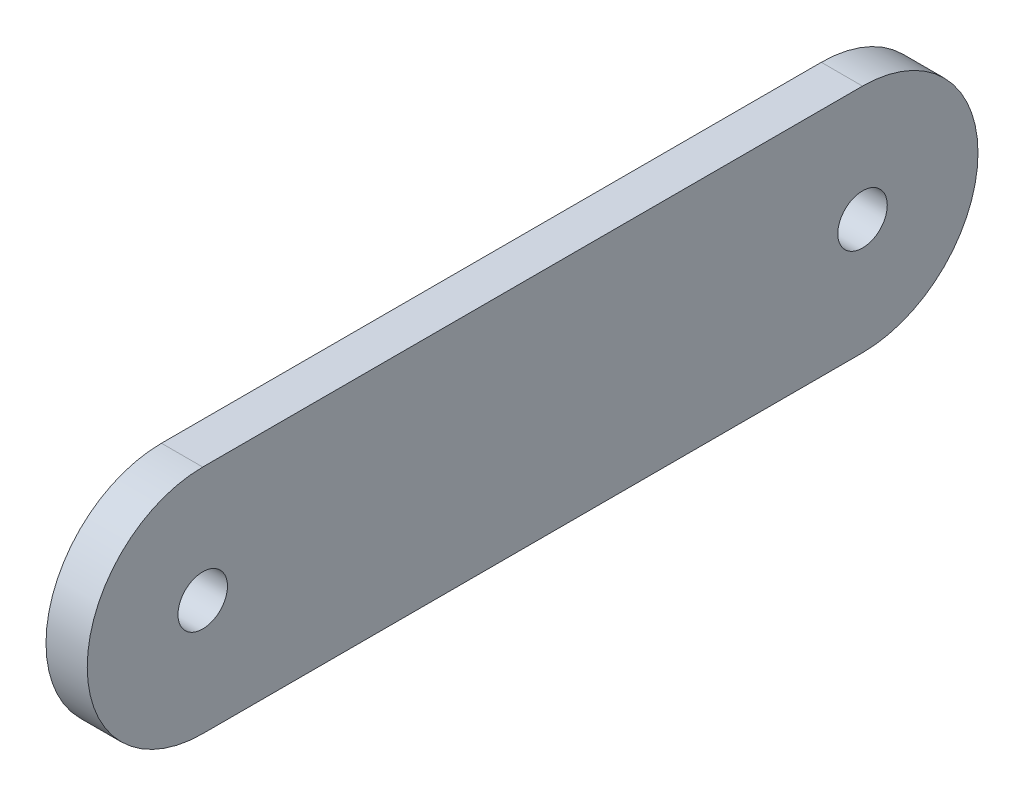
ISO-10303-21;
HEADER;
FILE_DESCRIPTION(('STEP AP214'),'2;1');
FILE_NAME('part.step','',(''),(''),'','','');
FILE_SCHEMA(('AUTOMOTIVE_DESIGN { 1 0 10303 214 1 1 1 1 }'));
ENDSEC;
DATA;
#1=APPLICATION_CONTEXT('core data for automotive mechanical design processes');
#2=APPLICATION_PROTOCOL_DEFINITION('international standard','automotive_design',2000,#1);
#3=PRODUCT_CONTEXT('',#1,'mechanical');
#4=PRODUCT('Part','Part','',(#3));
#5=PRODUCT_RELATED_PRODUCT_CATEGORY('part','',(#4));
#6=PRODUCT_DEFINITION_FORMATION('','',#4);
#7=PRODUCT_DEFINITION_CONTEXT('part definition',#1,'design');
#8=PRODUCT_DEFINITION('design','',#6,#7);
#9=PRODUCT_DEFINITION_SHAPE('','',#8);
#10=(LENGTH_UNIT() NAMED_UNIT(*) SI_UNIT(.MILLI.,.METRE.));
#11=(NAMED_UNIT(*) PLANE_ANGLE_UNIT() SI_UNIT($,.RADIAN.));
#12=(NAMED_UNIT(*) SI_UNIT($,.STERADIAN.) SOLID_ANGLE_UNIT());
#13=UNCERTAINTY_MEASURE_WITH_UNIT(LENGTH_MEASURE(1.E-05),#10,'distance_accuracy_value','');
#14=(GEOMETRIC_REPRESENTATION_CONTEXT(3) GLOBAL_UNCERTAINTY_ASSIGNED_CONTEXT((#13)) GLOBAL_UNIT_ASSIGNED_CONTEXT((#10,
#11,#12)) REPRESENTATION_CONTEXT('',''));
#15=CARTESIAN_POINT('',(0.,0.,0.));
#16=DIRECTION('',(0.,0.,1.));
#17=DIRECTION('',(1.,0.,0.));
#18=AXIS2_PLACEMENT_3D('',#15,#16,#17);
#19=CARTESIAN_POINT('',(2.5,0.,0.));
#20=DIRECTION('',(1.,0.,0.));
#21=DIRECTION('',(0.,0.,-1.));
#22=AXIS2_PLACEMENT_3D('',#19,#20,#21);
#23=PLANE('',#22);
#24=CARTESIAN_POINT('',(2.5,0.,40.));
#25=DIRECTION('',(1.,0.,0.));
#26=DIRECTION('',(0.,0.,-1.));
#27=AXIS2_PLACEMENT_3D('',#24,#25,#26);
#28=CIRCLE('',#27,1.5);
#29=CARTESIAN_POINT('',(2.5,0.,38.5));
#30=VERTEX_POINT('',#29);
#31=EDGE_CURVE('E101',#30,#30,#28,.T.);
#32=ORIENTED_EDGE('',*,*,#31,.F.);
#33=EDGE_LOOP('',(#32));
#34=FACE_BOUND('',#33,.T.);
#35=CARTESIAN_POINT('',(2.5,0.,0.));
#36=DIRECTION('',(1.,0.,0.));
#37=DIRECTION('',(0.,0.,-1.));
#38=AXIS2_PLACEMENT_3D('',#35,#36,#37);
#39=CIRCLE('',#38,7.);
#40=CARTESIAN_POINT('',(2.5,-7.,0.));
#41=VERTEX_POINT('',#40);
#42=CARTESIAN_POINT('',(2.5,7.,0.));
#43=VERTEX_POINT('',#42);
#44=EDGE_CURVE('E86',#41,#43,#39,.T.);
#45=ORIENTED_EDGE('',*,*,#44,.T.);
#46=DIRECTION('',(0.,0.,1.));
#47=VECTOR('',#46,1.);
#48=CARTESIAN_POINT('',(2.5,7.,0.));
#49=LINE('',#48,#47);
#50=CARTESIAN_POINT('',(2.5,7.,40.));
#51=VERTEX_POINT('',#50);
#52=EDGE_CURVE('E81',#43,#51,#49,.T.);
#53=ORIENTED_EDGE('',*,*,#52,.T.);
#54=CARTESIAN_POINT('',(2.5,0.,40.));
#55=DIRECTION('',(1.,0.,0.));
#56=DIRECTION('',(0.,0.,-1.));
#57=AXIS2_PLACEMENT_3D('',#54,#55,#56);
#58=CIRCLE('',#57,7.);
#59=CARTESIAN_POINT('',(2.5,-7.,40.));
#60=VERTEX_POINT('',#59);
#61=EDGE_CURVE('E84',#51,#60,#58,.T.);
#62=ORIENTED_EDGE('',*,*,#61,.T.);
#63=DIRECTION('',(0.,0.,-1.));
#64=VECTOR('',#63,1.);
#65=CARTESIAN_POINT('',(2.5,-7.,0.));
#66=LINE('',#65,#64);
#67=EDGE_CURVE('E51',#60,#41,#66,.T.);
#68=ORIENTED_EDGE('',*,*,#67,.T.);
#69=EDGE_LOOP('',(#45,#53,#62,#68));
#70=FACE_BOUND('',#69,.T.);
#71=CARTESIAN_POINT('',(2.5,0.,0.));
#72=DIRECTION('',(1.,0.,0.));
#73=DIRECTION('',(0.,0.,-1.));
#74=AXIS2_PLACEMENT_3D('',#71,#72,#73);
#75=CIRCLE('',#74,1.5);
#76=CARTESIAN_POINT('',(2.5,0.,-1.5));
#77=VERTEX_POINT('',#76);
#78=EDGE_CURVE('E116',#77,#77,#75,.T.);
#79=ORIENTED_EDGE('',*,*,#78,.F.);
#80=EDGE_LOOP('',(#79));
#81=FACE_BOUND('',#80,.T.);
#82=ADVANCED_FACE('F34',(#34,#70,#81),#23,.T.);
#83=CARTESIAN_POINT('',(0.,0.,0.));
#84=DIRECTION('',(1.,0.,0.));
#85=DIRECTION('',(0.,0.,-1.));
#86=AXIS2_PLACEMENT_3D('',#83,#84,#85);
#87=PLANE('',#86);
#88=CARTESIAN_POINT('',(0.,0.,0.));
#89=DIRECTION('',(1.,0.,0.));
#90=DIRECTION('',(0.,0.,-1.));
#91=AXIS2_PLACEMENT_3D('',#88,#89,#90);
#92=CIRCLE('',#91,7.);
#93=CARTESIAN_POINT('',(0.,-7.,0.));
#94=VERTEX_POINT('',#93);
#95=CARTESIAN_POINT('',(0.,7.,0.));
#96=VERTEX_POINT('',#95);
#97=EDGE_CURVE('E98',#94,#96,#92,.T.);
#98=ORIENTED_EDGE('',*,*,#97,.F.);
#99=DIRECTION('',(0.,0.,-1.));
#100=VECTOR('',#99,1.);
#101=CARTESIAN_POINT('',(0.,-7.,0.));
#102=LINE('',#101,#100);
#103=CARTESIAN_POINT('',(0.,-7.,40.));
#104=VERTEX_POINT('',#103);
#105=EDGE_CURVE('E74',#104,#94,#102,.T.);
#106=ORIENTED_EDGE('',*,*,#105,.F.);
#107=CARTESIAN_POINT('',(0.,0.,40.));
#108=DIRECTION('',(1.,0.,0.));
#109=DIRECTION('',(0.,0.,-1.));
#110=AXIS2_PLACEMENT_3D('',#107,#108,#109);
#111=CIRCLE('',#110,7.);
#112=CARTESIAN_POINT('',(0.,7.,40.));
#113=VERTEX_POINT('',#112);
#114=EDGE_CURVE('E68',#113,#104,#111,.T.);
#115=ORIENTED_EDGE('',*,*,#114,.F.);
#116=DIRECTION('',(0.,0.,1.));
#117=VECTOR('',#116,1.);
#118=CARTESIAN_POINT('',(0.,7.,0.));
#119=LINE('',#118,#117);
#120=EDGE_CURVE('E90',#96,#113,#119,.T.);
#121=ORIENTED_EDGE('',*,*,#120,.F.);
#122=EDGE_LOOP('',(#98,#106,#115,#121));
#123=FACE_BOUND('',#122,.T.);
#124=CARTESIAN_POINT('',(0.,0.,40.));
#125=DIRECTION('',(1.,0.,0.));
#126=DIRECTION('',(0.,0.,-1.));
#127=AXIS2_PLACEMENT_3D('',#124,#125,#126);
#128=CIRCLE('',#127,1.5);
#129=CARTESIAN_POINT('',(0.,0.,38.5));
#130=VERTEX_POINT('',#129);
#131=EDGE_CURVE('E113',#130,#130,#128,.T.);
#132=ORIENTED_EDGE('',*,*,#131,.T.);
#133=EDGE_LOOP('',(#132));
#134=FACE_BOUND('',#133,.T.);
#135=CARTESIAN_POINT('',(0.,0.,0.));
#136=DIRECTION('',(1.,0.,0.));
#137=DIRECTION('',(0.,0.,-1.));
#138=AXIS2_PLACEMENT_3D('',#135,#136,#137);
#139=CIRCLE('',#138,1.5);
#140=CARTESIAN_POINT('',(0.,0.,-1.5));
#141=VERTEX_POINT('',#140);
#142=EDGE_CURVE('E119',#141,#141,#139,.T.);
#143=ORIENTED_EDGE('',*,*,#142,.T.);
#144=EDGE_LOOP('',(#143));
#145=FACE_BOUND('',#144,.T.);
#146=ADVANCED_FACE('F109',(#123,#134,#145),#87,.F.);
#147=CARTESIAN_POINT('',(2.5,0.,0.));
#148=DIRECTION('',(-1.,0.,0.));
#149=DIRECTION('',(0.,0.,1.));
#150=AXIS2_PLACEMENT_3D('',#147,#148,#149);
#151=CYLINDRICAL_SURFACE('',#150,7.);
#152=ORIENTED_EDGE('',*,*,#97,.T.);
#153=DIRECTION('',(-1.,0.,0.));
#154=VECTOR('',#153,1.);
#155=CARTESIAN_POINT('',(2.5,7.,0.));
#156=LINE('',#155,#154);
#157=EDGE_CURVE('E11',#43,#96,#156,.T.);
#158=ORIENTED_EDGE('',*,*,#157,.F.);
#159=ORIENTED_EDGE('',*,*,#44,.F.);
#160=DIRECTION('',(-1.,0.,0.));
#161=VECTOR('',#160,1.);
#162=CARTESIAN_POINT('',(2.5,-7.,0.));
#163=LINE('',#162,#161);
#164=EDGE_CURVE('E94',#41,#94,#163,.T.);
#165=ORIENTED_EDGE('',*,*,#164,.T.);
#166=EDGE_LOOP('',(#152,#158,#159,#165));
#167=FACE_BOUND('',#166,.T.);
#168=ADVANCED_FACE('F36',(#167),#151,.T.);
#169=CARTESIAN_POINT('',(2.5,7.,0.));
#170=DIRECTION('',(0.,-1.,0.));
#171=DIRECTION('',(0.,0.,-1.));
#172=AXIS2_PLACEMENT_3D('',#169,#170,#171);
#173=PLANE('',#172);
#174=ORIENTED_EDGE('',*,*,#120,.T.);
#175=DIRECTION('',(-1.,0.,0.));
#176=VECTOR('',#175,1.);
#177=CARTESIAN_POINT('',(2.5,7.,40.));
#178=LINE('',#177,#176);
#179=EDGE_CURVE('E43',#51,#113,#178,.T.);
#180=ORIENTED_EDGE('',*,*,#179,.F.);
#181=ORIENTED_EDGE('',*,*,#52,.F.);
#182=ORIENTED_EDGE('',*,*,#157,.T.);
#183=EDGE_LOOP('',(#174,#180,#181,#182));
#184=FACE_BOUND('',#183,.T.);
#185=ADVANCED_FACE('F89',(#184),#173,.F.);
#186=CARTESIAN_POINT('',(2.5,0.,40.));
#187=DIRECTION('',(-1.,0.,0.));
#188=DIRECTION('',(0.,0.,1.));
#189=AXIS2_PLACEMENT_3D('',#186,#187,#188);
#190=CYLINDRICAL_SURFACE('',#189,7.);
#191=ORIENTED_EDGE('',*,*,#114,.T.);
#192=DIRECTION('',(-1.,0.,0.));
#193=VECTOR('',#192,1.);
#194=CARTESIAN_POINT('',(2.5,-7.,40.));
#195=LINE('',#194,#193);
#196=EDGE_CURVE('E91',#60,#104,#195,.T.);
#197=ORIENTED_EDGE('',*,*,#196,.F.);
#198=ORIENTED_EDGE('',*,*,#61,.F.);
#199=ORIENTED_EDGE('',*,*,#179,.T.);
#200=EDGE_LOOP('',(#191,#197,#198,#199));
#201=FACE_BOUND('',#200,.T.);
#202=ADVANCED_FACE('F92',(#201),#190,.T.);
#203=CARTESIAN_POINT('',(2.5,-7.,0.));
#204=DIRECTION('',(0.,1.,0.));
#205=DIRECTION('',(0.,0.,1.));
#206=AXIS2_PLACEMENT_3D('',#203,#204,#205);
#207=PLANE('',#206);
#208=ORIENTED_EDGE('',*,*,#105,.T.);
#209=ORIENTED_EDGE('',*,*,#164,.F.);
#210=ORIENTED_EDGE('',*,*,#67,.F.);
#211=ORIENTED_EDGE('',*,*,#196,.T.);
#212=EDGE_LOOP('',(#208,#209,#210,#211));
#213=FACE_BOUND('',#212,.T.);
#214=ADVANCED_FACE('F106',(#213),#207,.F.);
#215=CARTESIAN_POINT('',(2.5,0.,40.));
#216=DIRECTION('',(-1.,0.,0.));
#217=DIRECTION('',(0.,0.,1.));
#218=AXIS2_PLACEMENT_3D('',#215,#216,#217);
#219=CYLINDRICAL_SURFACE('',#218,1.5);
#220=ORIENTED_EDGE('',*,*,#31,.T.);
#221=EDGE_LOOP('',(#220));
#222=FACE_BOUND('',#221,.T.);
#223=ORIENTED_EDGE('',*,*,#131,.F.);
#224=EDGE_LOOP('',(#223));
#225=FACE_BOUND('',#224,.T.);
#226=ADVANCED_FACE('F136',(#222,#225),#219,.F.);
#227=CARTESIAN_POINT('',(2.5,0.,0.));
#228=DIRECTION('',(-1.,0.,0.));
#229=DIRECTION('',(0.,0.,1.));
#230=AXIS2_PLACEMENT_3D('',#227,#228,#229);
#231=CYLINDRICAL_SURFACE('',#230,1.5);
#232=ORIENTED_EDGE('',*,*,#78,.T.);
#233=EDGE_LOOP('',(#232));
#234=FACE_BOUND('',#233,.T.);
#235=ORIENTED_EDGE('',*,*,#142,.F.);
#236=EDGE_LOOP('',(#235));
#237=FACE_BOUND('',#236,.T.);
#238=ADVANCED_FACE('F125',(#234,#237),#231,.F.);
#239=CLOSED_SHELL('',(#82,#146,#168,#185,#202,#214,#226,#238));
#240=MANIFOLD_SOLID_BREP('B2',#239);
#241=ADVANCED_BREP_SHAPE_REPRESENTATION('',(#18,#240),#14);
#242=SHAPE_DEFINITION_REPRESENTATION(#9,#241);
ENDSEC;
END-ISO-10303-21;
